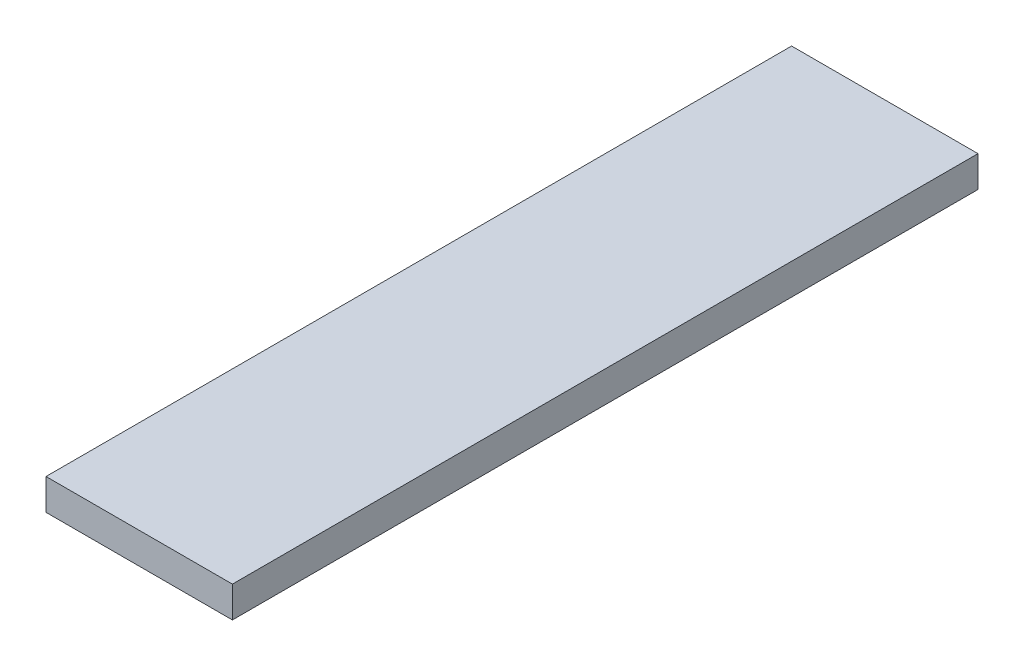
ISO-10303-21;
HEADER;
FILE_DESCRIPTION(('STEP AP214'),'2;1');
FILE_NAME('part.step','',(''),(''),'','','');
FILE_SCHEMA(('AUTOMOTIVE_DESIGN { 1 0 10303 214 1 1 1 1 }'));
ENDSEC;
DATA;
#1=APPLICATION_CONTEXT('core data for automotive mechanical design processes');
#2=APPLICATION_PROTOCOL_DEFINITION('international standard','automotive_design',2000,#1);
#3=PRODUCT_CONTEXT('',#1,'mechanical');
#4=PRODUCT('Part','Part','',(#3));
#5=PRODUCT_RELATED_PRODUCT_CATEGORY('part','',(#4));
#6=PRODUCT_DEFINITION_FORMATION('','',#4);
#7=PRODUCT_DEFINITION_CONTEXT('part definition',#1,'design');
#8=PRODUCT_DEFINITION('design','',#6,#7);
#9=PRODUCT_DEFINITION_SHAPE('','',#8);
#10=(LENGTH_UNIT() NAMED_UNIT(*) SI_UNIT(.MILLI.,.METRE.));
#11=(NAMED_UNIT(*) PLANE_ANGLE_UNIT() SI_UNIT($,.RADIAN.));
#12=(NAMED_UNIT(*) SI_UNIT($,.STERADIAN.) SOLID_ANGLE_UNIT());
#13=UNCERTAINTY_MEASURE_WITH_UNIT(LENGTH_MEASURE(1.E-05),#10,'distance_accuracy_value','');
#14=(GEOMETRIC_REPRESENTATION_CONTEXT(3) GLOBAL_UNCERTAINTY_ASSIGNED_CONTEXT((#13)) GLOBAL_UNIT_ASSIGNED_CONTEXT((#10,
#11,#12)) REPRESENTATION_CONTEXT('',''));
#15=CARTESIAN_POINT('',(0.,0.,0.));
#16=DIRECTION('',(0.,0.,1.));
#17=DIRECTION('',(1.,0.,0.));
#18=AXIS2_PLACEMENT_3D('',#15,#16,#17);
#19=CARTESIAN_POINT('',(-19.05,6.35,76.2));
#20=DIRECTION('',(1.,0.,0.));
#21=DIRECTION('',(0.,0.,-1.));
#22=AXIS2_PLACEMENT_3D('',#19,#20,#21);
#23=PLANE('',#22);
#24=DIRECTION('',(0.,0.,1.));
#25=VECTOR('',#24,1.);
#26=CARTESIAN_POINT('',(-19.05,0.,76.2));
#27=LINE('',#26,#25);
#28=CARTESIAN_POINT('',(-19.05,0.,-76.2));
#29=VERTEX_POINT('',#28);
#30=CARTESIAN_POINT('',(-19.05,0.,76.2));
#31=VERTEX_POINT('',#30);
#32=EDGE_CURVE('E105',#29,#31,#27,.T.);
#33=ORIENTED_EDGE('',*,*,#32,.T.);
#34=DIRECTION('',(0.,-1.,0.));
#35=VECTOR('',#34,1.);
#36=CARTESIAN_POINT('',(-19.05,6.35,76.2));
#37=LINE('',#36,#35);
#38=CARTESIAN_POINT('',(-19.05,6.35,76.2));
#39=VERTEX_POINT('',#38);
#40=EDGE_CURVE('E11',#39,#31,#37,.T.);
#41=ORIENTED_EDGE('',*,*,#40,.F.);
#42=DIRECTION('',(0.,0.,1.));
#43=VECTOR('',#42,1.);
#44=CARTESIAN_POINT('',(-19.05,6.35,76.2));
#45=LINE('',#44,#43);
#46=CARTESIAN_POINT('',(-19.05,6.35,-76.2));
#47=VERTEX_POINT('',#46);
#48=EDGE_CURVE('E88',#47,#39,#45,.T.);
#49=ORIENTED_EDGE('',*,*,#48,.F.);
#50=DIRECTION('',(0.,-1.,0.));
#51=VECTOR('',#50,1.);
#52=CARTESIAN_POINT('',(-19.05,6.35,-76.2));
#53=LINE('',#52,#51);
#54=EDGE_CURVE('E101',#47,#29,#53,.T.);
#55=ORIENTED_EDGE('',*,*,#54,.T.);
#56=EDGE_LOOP('',(#33,#41,#49,#55));
#57=FACE_BOUND('',#56,.T.);
#58=ADVANCED_FACE('F36',(#57),#23,.F.);
#59=CARTESIAN_POINT('',(19.05,6.35,76.2));
#60=DIRECTION('',(0.,0.,-1.));
#61=DIRECTION('',(-1.,0.,0.));
#62=AXIS2_PLACEMENT_3D('',#59,#60,#61);
#63=PLANE('',#62);
#64=DIRECTION('',(1.,0.,0.));
#65=VECTOR('',#64,1.);
#66=CARTESIAN_POINT('',(19.05,0.,76.2));
#67=LINE('',#66,#65);
#68=CARTESIAN_POINT('',(19.05,0.,76.2));
#69=VERTEX_POINT('',#68);
#70=EDGE_CURVE('E93',#31,#69,#67,.T.);
#71=ORIENTED_EDGE('',*,*,#70,.T.);
#72=DIRECTION('',(0.,-1.,0.));
#73=VECTOR('',#72,1.);
#74=CARTESIAN_POINT('',(19.05,6.35,76.2));
#75=LINE('',#74,#73);
#76=CARTESIAN_POINT('',(19.05,6.35,76.2));
#77=VERTEX_POINT('',#76);
#78=EDGE_CURVE('E45',#77,#69,#75,.T.);
#79=ORIENTED_EDGE('',*,*,#78,.F.);
#80=DIRECTION('',(1.,0.,0.));
#81=VECTOR('',#80,1.);
#82=CARTESIAN_POINT('',(19.05,6.35,76.2));
#83=LINE('',#82,#81);
#84=EDGE_CURVE('E83',#39,#77,#83,.T.);
#85=ORIENTED_EDGE('',*,*,#84,.F.);
#86=ORIENTED_EDGE('',*,*,#40,.T.);
#87=EDGE_LOOP('',(#71,#79,#85,#86));
#88=FACE_BOUND('',#87,.T.);
#89=ADVANCED_FACE('F92',(#88),#63,.F.);
#90=CARTESIAN_POINT('',(19.05,6.35,76.2));
#91=DIRECTION('',(-1.,0.,0.));
#92=DIRECTION('',(0.,0.,1.));
#93=AXIS2_PLACEMENT_3D('',#90,#91,#92);
#94=PLANE('',#93);
#95=DIRECTION('',(0.,0.,-1.));
#96=VECTOR('',#95,1.);
#97=CARTESIAN_POINT('',(19.05,0.,76.2));
#98=LINE('',#97,#96);
#99=CARTESIAN_POINT('',(19.05,0.,-76.2));
#100=VERTEX_POINT('',#99);
#101=EDGE_CURVE('E70',#69,#100,#98,.T.);
#102=ORIENTED_EDGE('',*,*,#101,.T.);
#103=DIRECTION('',(0.,-1.,0.));
#104=VECTOR('',#103,1.);
#105=CARTESIAN_POINT('',(19.05,6.35,-76.2));
#106=LINE('',#105,#104);
#107=CARTESIAN_POINT('',(19.05,6.35,-76.2));
#108=VERTEX_POINT('',#107);
#109=EDGE_CURVE('E95',#108,#100,#106,.T.);
#110=ORIENTED_EDGE('',*,*,#109,.F.);
#111=DIRECTION('',(0.,0.,-1.));
#112=VECTOR('',#111,1.);
#113=CARTESIAN_POINT('',(19.05,6.35,76.2));
#114=LINE('',#113,#112);
#115=EDGE_CURVE('E86',#77,#108,#114,.T.);
#116=ORIENTED_EDGE('',*,*,#115,.F.);
#117=ORIENTED_EDGE('',*,*,#78,.T.);
#118=EDGE_LOOP('',(#102,#110,#116,#117));
#119=FACE_BOUND('',#118,.T.);
#120=ADVANCED_FACE('F96',(#119),#94,.F.);
#121=CARTESIAN_POINT('',(19.05,6.35,-76.2));
#122=DIRECTION('',(0.,0.,1.));
#123=DIRECTION('',(1.,0.,0.));
#124=AXIS2_PLACEMENT_3D('',#121,#122,#123);
#125=PLANE('',#124);
#126=DIRECTION('',(-1.,0.,0.));
#127=VECTOR('',#126,1.);
#128=CARTESIAN_POINT('',(19.05,0.,-76.2));
#129=LINE('',#128,#127);
#130=EDGE_CURVE('E76',#100,#29,#129,.T.);
#131=ORIENTED_EDGE('',*,*,#130,.T.);
#132=ORIENTED_EDGE('',*,*,#54,.F.);
#133=DIRECTION('',(-1.,0.,0.));
#134=VECTOR('',#133,1.);
#135=CARTESIAN_POINT('',(19.05,6.35,-76.2));
#136=LINE('',#135,#134);
#137=EDGE_CURVE('E53',#108,#47,#136,.T.);
#138=ORIENTED_EDGE('',*,*,#137,.F.);
#139=ORIENTED_EDGE('',*,*,#109,.T.);
#140=EDGE_LOOP('',(#131,#132,#138,#139));
#141=FACE_BOUND('',#140,.T.);
#142=ADVANCED_FACE('F118',(#141),#125,.F.);
#143=CARTESIAN_POINT('',(0.,6.35,0.));
#144=DIRECTION('',(0.,1.,0.));
#145=DIRECTION('',(0.,0.,1.));
#146=AXIS2_PLACEMENT_3D('',#143,#144,#145);
#147=PLANE('',#146);
#148=ORIENTED_EDGE('',*,*,#48,.T.);
#149=ORIENTED_EDGE('',*,*,#84,.T.);
#150=ORIENTED_EDGE('',*,*,#115,.T.);
#151=ORIENTED_EDGE('',*,*,#137,.T.);
#152=EDGE_LOOP('',(#148,#149,#150,#151));
#153=FACE_BOUND('',#152,.T.);
#154=ADVANCED_FACE('F84',(#153),#147,.T.);
#155=CARTESIAN_POINT('',(0.,0.,0.));
#156=DIRECTION('',(0.,1.,0.));
#157=DIRECTION('',(0.,0.,1.));
#158=AXIS2_PLACEMENT_3D('',#155,#156,#157);
#159=PLANE('',#158);
#160=ORIENTED_EDGE('',*,*,#32,.F.);
#161=ORIENTED_EDGE('',*,*,#130,.F.);
#162=ORIENTED_EDGE('',*,*,#101,.F.);
#163=ORIENTED_EDGE('',*,*,#70,.F.);
#164=EDGE_LOOP('',(#160,#161,#162,#163));
#165=FACE_BOUND('',#164,.T.);
#166=ADVANCED_FACE('F121',(#165),#159,.F.);
#167=CLOSED_SHELL('',(#58,#89,#120,#142,#154,#166));
#168=MANIFOLD_SOLID_BREP('B2',#167);
#169=ADVANCED_BREP_SHAPE_REPRESENTATION('',(#18,#168),#14);
#170=SHAPE_DEFINITION_REPRESENTATION(#9,#169);
ENDSEC;
END-ISO-10303-21;
